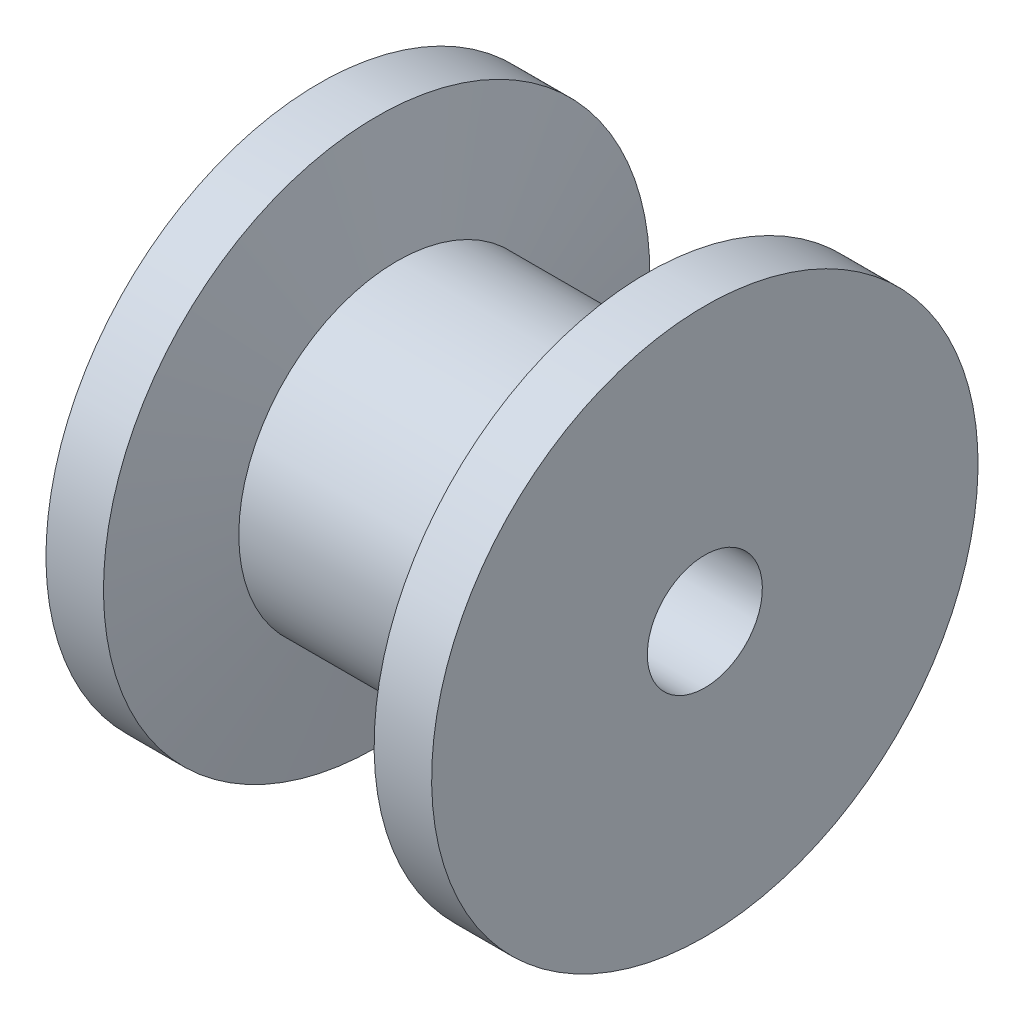
ISO-10303-21;
HEADER;
FILE_DESCRIPTION(('STEP AP214'),'2;1');
FILE_NAME('part.step','',(''),(''),'','','');
FILE_SCHEMA(('AUTOMOTIVE_DESIGN { 1 0 10303 214 1 1 1 1 }'));
ENDSEC;
DATA;
#1=APPLICATION_CONTEXT('core data for automotive mechanical design processes');
#2=APPLICATION_PROTOCOL_DEFINITION('international standard','automotive_design',2000,#1);
#3=PRODUCT_CONTEXT('',#1,'mechanical');
#4=PRODUCT('Part','Part','',(#3));
#5=PRODUCT_RELATED_PRODUCT_CATEGORY('part','',(#4));
#6=PRODUCT_DEFINITION_FORMATION('','',#4);
#7=PRODUCT_DEFINITION_CONTEXT('part definition',#1,'design');
#8=PRODUCT_DEFINITION('design','',#6,#7);
#9=PRODUCT_DEFINITION_SHAPE('','',#8);
#10=(LENGTH_UNIT() NAMED_UNIT(*) SI_UNIT(.MILLI.,.METRE.));
#11=(NAMED_UNIT(*) PLANE_ANGLE_UNIT() SI_UNIT($,.RADIAN.));
#12=(NAMED_UNIT(*) SI_UNIT($,.STERADIAN.) SOLID_ANGLE_UNIT());
#13=UNCERTAINTY_MEASURE_WITH_UNIT(LENGTH_MEASURE(1.E-05),#10,'distance_accuracy_value','');
#14=(GEOMETRIC_REPRESENTATION_CONTEXT(3) GLOBAL_UNCERTAINTY_ASSIGNED_CONTEXT((#13)) GLOBAL_UNIT_ASSIGNED_CONTEXT((#10,
#11,#12)) REPRESENTATION_CONTEXT('',''));
#15=CARTESIAN_POINT('',(0.,0.,0.));
#16=DIRECTION('',(0.,0.,1.));
#17=DIRECTION('',(1.,0.,0.));
#18=AXIS2_PLACEMENT_3D('',#15,#16,#17);
#19=CARTESIAN_POINT('',(-34.8315274783818,0.,0.));
#20=DIRECTION('',(-1.,0.,0.));
#21=DIRECTION('',(0.,-1.,0.));
#22=AXIS2_PLACEMENT_3D('',#19,#20,#21);
#23=CYLINDRICAL_SURFACE('',#22,9.50000000000003);
#24=CARTESIAN_POINT('',(-23.4209116327141,0.,0.));
#25=DIRECTION('',(-1.,0.,0.));
#26=DIRECTION('',(0.,-1.,0.));
#27=AXIS2_PLACEMENT_3D('',#24,#25,#26);
#28=CIRCLE('',#27,9.50000000000003);
#29=CARTESIAN_POINT('',(-23.4209116327141,-9.50000000000003,0.));
#30=VERTEX_POINT('',#29);
#31=EDGE_CURVE('E10',#30,#30,#28,.T.);
#32=ORIENTED_EDGE('',*,*,#31,.F.);
#33=EDGE_LOOP('',(#32));
#34=FACE_BOUND('',#33,.T.);
#35=CARTESIAN_POINT('',(-21.4209116327141,0.,0.));
#36=DIRECTION('',(-1.,0.,0.));
#37=DIRECTION('',(0.,-1.,0.));
#38=AXIS2_PLACEMENT_3D('',#35,#36,#37);
#39=CIRCLE('',#38,9.50000000000003);
#40=CARTESIAN_POINT('',(-21.4209116327141,-9.50000000000003,0.));
#41=VERTEX_POINT('',#40);
#42=EDGE_CURVE('E72',#41,#41,#39,.T.);
#43=ORIENTED_EDGE('',*,*,#42,.T.);
#44=EDGE_LOOP('',(#43));
#45=FACE_BOUND('',#44,.T.);
#46=ADVANCED_FACE('F37',(#34,#45),#23,.T.);
#47=CARTESIAN_POINT('',(-23.4209116327141,0.,0.));
#48=DIRECTION('',(1.,0.,0.));
#49=DIRECTION('',(0.,1.,0.));
#50=AXIS2_PLACEMENT_3D('',#47,#48,#49);
#51=CONICAL_SURFACE('',#50,9.50000000000003,1.39626340159547);
#52=CARTESIAN_POINT('',(-24.126219555548,0.,0.));
#53=DIRECTION('',(-1.,0.,0.));
#54=DIRECTION('',(0.,-1.,0.));
#55=AXIS2_PLACEMENT_3D('',#52,#53,#54);
#56=CIRCLE('',#55,5.50000000000003);
#57=CARTESIAN_POINT('',(-24.126219555548,-5.50000000000003,0.));
#58=VERTEX_POINT('',#57);
#59=EDGE_CURVE('E44',#58,#58,#56,.T.);
#60=ORIENTED_EDGE('',*,*,#59,.F.);
#61=EDGE_LOOP('',(#60));
#62=FACE_BOUND('',#61,.T.);
#63=ORIENTED_EDGE('',*,*,#31,.T.);
#64=EDGE_LOOP('',(#63));
#65=FACE_BOUND('',#64,.T.);
#66=ADVANCED_FACE('F101',(#62,#65),#51,.T.);
#67=CARTESIAN_POINT('',(-34.8315274783818,0.,0.));
#68=DIRECTION('',(-1.,0.,0.));
#69=DIRECTION('',(0.,-1.,0.));
#70=AXIS2_PLACEMENT_3D('',#67,#68,#69);
#71=CYLINDRICAL_SURFACE('',#70,5.50000000000003);
#72=CARTESIAN_POINT('',(-32.126219555548,0.,0.));
#73=DIRECTION('',(-1.,0.,0.));
#74=DIRECTION('',(0.,-1.,0.));
#75=AXIS2_PLACEMENT_3D('',#72,#73,#74);
#76=CIRCLE('',#75,5.50000000000002);
#77=CARTESIAN_POINT('',(-32.126219555548,-5.50000000000003,0.));
#78=VERTEX_POINT('',#77);
#79=EDGE_CURVE('E49',#78,#78,#76,.T.);
#80=ORIENTED_EDGE('',*,*,#79,.F.);
#81=EDGE_LOOP('',(#80));
#82=FACE_BOUND('',#81,.T.);
#83=ORIENTED_EDGE('',*,*,#59,.T.);
#84=EDGE_LOOP('',(#83));
#85=FACE_BOUND('',#84,.T.);
#86=ADVANCED_FACE('F106',(#82,#85),#71,.T.);
#87=CARTESIAN_POINT('',(-32.126219555548,0.,0.));
#88=DIRECTION('',(-1.,0.,0.));
#89=DIRECTION('',(0.,-1.,0.));
#90=AXIS2_PLACEMENT_3D('',#87,#88,#89);
#91=CONICAL_SURFACE('',#90,5.50000000000002,1.39626340159547);
#92=CARTESIAN_POINT('',(-32.8315274783818,0.,0.));
#93=DIRECTION('',(-1.,0.,0.));
#94=DIRECTION('',(0.,-1.,0.));
#95=AXIS2_PLACEMENT_3D('',#92,#93,#94);
#96=CIRCLE('',#95,9.5);
#97=CARTESIAN_POINT('',(-32.8315274783818,-9.5,0.));
#98=VERTEX_POINT('',#97);
#99=EDGE_CURVE('E54',#98,#98,#96,.T.);
#100=ORIENTED_EDGE('',*,*,#99,.F.);
#101=EDGE_LOOP('',(#100));
#102=FACE_BOUND('',#101,.T.);
#103=ORIENTED_EDGE('',*,*,#79,.T.);
#104=EDGE_LOOP('',(#103));
#105=FACE_BOUND('',#104,.T.);
#106=ADVANCED_FACE('F111',(#102,#105),#91,.T.);
#107=CARTESIAN_POINT('',(-34.8315274783818,0.,0.));
#108=DIRECTION('',(-1.,0.,0.));
#109=DIRECTION('',(0.,-1.,0.));
#110=AXIS2_PLACEMENT_3D('',#107,#108,#109);
#111=CYLINDRICAL_SURFACE('',#110,9.50000000000001);
#112=CARTESIAN_POINT('',(-34.8315274783818,0.,0.));
#113=DIRECTION('',(-1.,0.,0.));
#114=DIRECTION('',(0.,-1.,0.));
#115=AXIS2_PLACEMENT_3D('',#112,#113,#114);
#116=CIRCLE('',#115,9.50000000000001);
#117=CARTESIAN_POINT('',(-34.8315274783818,-9.50000000000001,0.));
#118=VERTEX_POINT('',#117);
#119=EDGE_CURVE('E60',#118,#118,#116,.T.);
#120=ORIENTED_EDGE('',*,*,#119,.F.);
#121=EDGE_LOOP('',(#120));
#122=FACE_BOUND('',#121,.T.);
#123=ORIENTED_EDGE('',*,*,#99,.T.);
#124=EDGE_LOOP('',(#123));
#125=FACE_BOUND('',#124,.T.);
#126=ADVANCED_FACE('F97',(#122,#125),#111,.T.);
#127=CARTESIAN_POINT('',(-34.8315274783818,3.00000000000001,0.));
#128=DIRECTION('',(1.,0.,0.));
#129=DIRECTION('',(0.,1.,0.));
#130=AXIS2_PLACEMENT_3D('',#127,#128,#129);
#131=PLANE('',#130);
#132=ORIENTED_EDGE('',*,*,#119,.T.);
#133=EDGE_LOOP('',(#132));
#134=FACE_BOUND('',#133,.T.);
#135=ADVANCED_FACE('F92',(#134),#131,.F.);
#136=CARTESIAN_POINT('',(-33.4209116327141,1.99999999999999,0.));
#137=DIRECTION('',(-1.,0.,0.));
#138=DIRECTION('',(0.,-1.,0.));
#139=AXIS2_PLACEMENT_3D('',#136,#137,#138);
#140=PLANE('',#139);
#141=CARTESIAN_POINT('',(-33.4209116327141,0.,0.));
#142=DIRECTION('',(-1.,0.,0.));
#143=DIRECTION('',(0.,-1.,0.));
#144=AXIS2_PLACEMENT_3D('',#141,#142,#143);
#145=CIRCLE('',#144,1.99999999999999);
#146=CARTESIAN_POINT('',(-33.4209116327141,-1.99999999999999,0.));
#147=VERTEX_POINT('',#146);
#148=EDGE_CURVE('E64',#147,#147,#145,.T.);
#149=ORIENTED_EDGE('',*,*,#148,.F.);
#150=EDGE_LOOP('',(#149));
#151=FACE_BOUND('',#150,.T.);
#152=ADVANCED_FACE('F87',(#151),#140,.F.);
#153=CARTESIAN_POINT('',(-34.8315274783818,0.,0.));
#154=DIRECTION('',(-1.,0.,0.));
#155=DIRECTION('',(0.,-1.,0.));
#156=AXIS2_PLACEMENT_3D('',#153,#154,#155);
#157=CYLINDRICAL_SURFACE('',#156,1.99999999999999);
#158=CARTESIAN_POINT('',(-21.4209116327141,0.,0.));
#159=DIRECTION('',(-1.,0.,0.));
#160=DIRECTION('',(0.,-1.,0.));
#161=AXIS2_PLACEMENT_3D('',#158,#159,#160);
#162=CIRCLE('',#161,1.99999999999999);
#163=CARTESIAN_POINT('',(-21.4209116327141,-1.99999999999999,0.));
#164=VERTEX_POINT('',#163);
#165=EDGE_CURVE('E68',#164,#164,#162,.T.);
#166=ORIENTED_EDGE('',*,*,#165,.F.);
#167=EDGE_LOOP('',(#166));
#168=FACE_BOUND('',#167,.T.);
#169=ORIENTED_EDGE('',*,*,#148,.T.);
#170=EDGE_LOOP('',(#169));
#171=FACE_BOUND('',#170,.T.);
#172=ADVANCED_FACE('F81',(#168,#171),#157,.F.);
#173=CARTESIAN_POINT('',(-21.4209116327141,1.99999999999999,0.));
#174=DIRECTION('',(-1.,0.,0.));
#175=DIRECTION('',(0.,-1.,0.));
#176=AXIS2_PLACEMENT_3D('',#173,#174,#175);
#177=PLANE('',#176);
#178=ORIENTED_EDGE('',*,*,#42,.F.);
#179=EDGE_LOOP('',(#178));
#180=FACE_BOUND('',#179,.T.);
#181=ORIENTED_EDGE('',*,*,#165,.T.);
#182=EDGE_LOOP('',(#181));
#183=FACE_BOUND('',#182,.T.);
#184=ADVANCED_FACE('F78',(#180,#183),#177,.F.);
#185=CLOSED_SHELL('',(#46,#66,#86,#106,#126,#135,#152,#172,#184));
#186=MANIFOLD_SOLID_BREP('B2',#185);
#187=ADVANCED_BREP_SHAPE_REPRESENTATION('',(#18,#186),#14);
#188=SHAPE_DEFINITION_REPRESENTATION(#9,#187);
ENDSEC;
END-ISO-10303-21;
